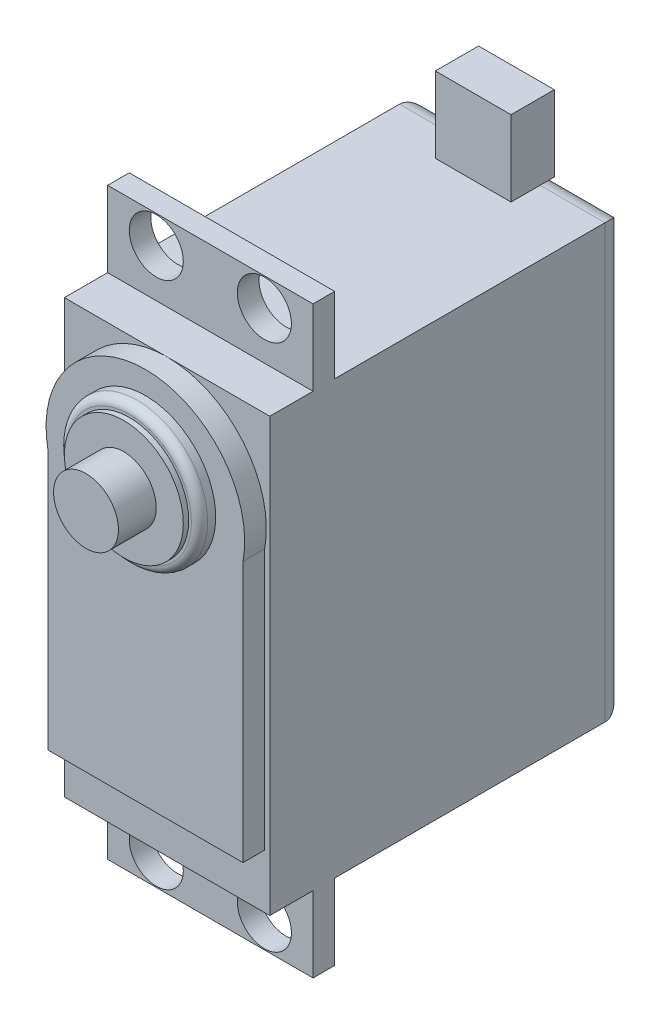
ISO-10303-21;
HEADER;
FILE_DESCRIPTION(('STEP AP214'),'2;1');
FILE_NAME('part.step','',(''),(''),'','','');
FILE_SCHEMA(('AUTOMOTIVE_DESIGN { 1 0 10303 214 1 1 1 1 }'));
ENDSEC;
DATA;
#1=APPLICATION_CONTEXT('core data for automotive mechanical design processes');
#2=APPLICATION_PROTOCOL_DEFINITION('international standard','automotive_design',2000,#1);
#3=PRODUCT_CONTEXT('',#1,'mechanical');
#4=PRODUCT('Part','Part','',(#3));
#5=PRODUCT_RELATED_PRODUCT_CATEGORY('part','',(#4));
#6=PRODUCT_DEFINITION_FORMATION('','',#4);
#7=PRODUCT_DEFINITION_CONTEXT('part definition',#1,'design');
#8=PRODUCT_DEFINITION('design','',#6,#7);
#9=PRODUCT_DEFINITION_SHAPE('','',#8);
#10=(LENGTH_UNIT() NAMED_UNIT(*) SI_UNIT(.MILLI.,.METRE.));
#11=(NAMED_UNIT(*) PLANE_ANGLE_UNIT() SI_UNIT($,.RADIAN.));
#12=(NAMED_UNIT(*) SI_UNIT($,.STERADIAN.) SOLID_ANGLE_UNIT());
#13=UNCERTAINTY_MEASURE_WITH_UNIT(LENGTH_MEASURE(1.E-05),#10,'distance_accuracy_value','');
#14=(GEOMETRIC_REPRESENTATION_CONTEXT(3) GLOBAL_UNCERTAINTY_ASSIGNED_CONTEXT((#13)) GLOBAL_UNIT_ASSIGNED_CONTEXT((#10,
#11,#12)) REPRESENTATION_CONTEXT('',''));
#15=CARTESIAN_POINT('',(0.,0.,0.));
#16=DIRECTION('',(0.,0.,1.));
#17=DIRECTION('',(1.,0.,0.));
#18=AXIS2_PLACEMENT_3D('',#15,#16,#17);
#19=CARTESIAN_POINT('',(9.5,40.,-6.));
#20=DIRECTION('',(0.,-1.,0.));
#21=DIRECTION('',(0.,0.,-1.));
#22=AXIS2_PLACEMENT_3D('',#19,#20,#21);
#23=PLANE('',#22);
#24=DIRECTION('',(0.,0.,1.));
#25=VECTOR('',#24,1.);
#26=CARTESIAN_POINT('',(-3.5,40.,-32.3142135623731));
#27=LINE('',#26,#25);
#28=CARTESIAN_POINT('',(-3.5,40.,-31.));
#29=VERTEX_POINT('',#28);
#30=CARTESIAN_POINT('',(-3.5,40.,-28.3142135623731));
#31=VERTEX_POINT('',#30);
#32=EDGE_CURVE('E517',#29,#31,#27,.T.);
#33=ORIENTED_EDGE('',*,*,#32,.F.);
#34=DIRECTION('',(-1.,0.,0.));
#35=VECTOR('',#34,1.);
#36=CARTESIAN_POINT('',(9.5,40.,-31.));
#37=LINE('',#36,#35);
#38=CARTESIAN_POINT('',(-9.5,40.,-31.));
#39=VERTEX_POINT('',#38);
#40=EDGE_CURVE('E391',#29,#39,#37,.T.);
#41=ORIENTED_EDGE('',*,*,#40,.T.);
#42=DIRECTION('',(0.,0.,1.));
#43=VECTOR('',#42,1.);
#44=CARTESIAN_POINT('',(-9.5,40.,-6.));
#45=LINE('',#44,#43);
#46=CARTESIAN_POINT('',(-9.5,40.,-6.));
#47=VERTEX_POINT('',#46);
#48=EDGE_CURVE('E333',#39,#47,#45,.T.);
#49=ORIENTED_EDGE('',*,*,#48,.T.);
#50=DIRECTION('',(-1.,0.,0.));
#51=VECTOR('',#50,1.);
#52=CARTESIAN_POINT('',(9.5,40.,-6.));
#53=LINE('',#52,#51);
#54=CARTESIAN_POINT('',(9.5,40.,-6.));
#55=VERTEX_POINT('',#54);
#56=EDGE_CURVE('E355',#55,#47,#53,.T.);
#57=ORIENTED_EDGE('',*,*,#56,.F.);
#58=DIRECTION('',(0.,0.,1.));
#59=VECTOR('',#58,1.);
#60=CARTESIAN_POINT('',(9.5,40.,-6.));
#61=LINE('',#60,#59);
#62=CARTESIAN_POINT('',(9.5,40.,-31.));
#63=VERTEX_POINT('',#62);
#64=EDGE_CURVE('E309',#63,#55,#61,.T.);
#65=ORIENTED_EDGE('',*,*,#64,.F.);
#66=CARTESIAN_POINT('',(3.5,40.,-31.));
#67=VERTEX_POINT('',#66);
#68=EDGE_CURVE('E392',#63,#67,#37,.T.);
#69=ORIENTED_EDGE('',*,*,#68,.T.);
#70=DIRECTION('',(0.,0.,-1.));
#71=VECTOR('',#70,1.);
#72=CARTESIAN_POINT('',(3.5,40.,-28.3142135623731));
#73=LINE('',#72,#71);
#74=CARTESIAN_POINT('',(3.5,40.,-28.3142135623731));
#75=VERTEX_POINT('',#74);
#76=EDGE_CURVE('E57',#75,#67,#73,.T.);
#77=ORIENTED_EDGE('',*,*,#76,.F.);
#78=DIRECTION('',(1.,0.,0.));
#79=VECTOR('',#78,1.);
#80=CARTESIAN_POINT('',(-3.5,40.,-28.3142135623731));
#81=LINE('',#80,#79);
#82=EDGE_CURVE('E52',#31,#75,#81,.T.);
#83=ORIENTED_EDGE('',*,*,#82,.F.);
#84=EDGE_LOOP('',(#33,#41,#49,#57,#65,#69,#77,#83));
#85=FACE_BOUND('',#84,.T.);
#86=ADVANCED_FACE('F37',(#85),#23,.F.);
#87=CARTESIAN_POINT('',(0.,31.409074500075,4.));
#88=DIRECTION('',(0.,0.,1.));
#89=DIRECTION('',(1.,0.,0.));
#90=AXIS2_PLACEMENT_3D('',#87,#88,#89);
#91=PLANE('',#90);
#92=CARTESIAN_POINT('',(0.,31.409074500075,4.));
#93=DIRECTION('',(0.,0.,1.));
#94=DIRECTION('',(1.,0.,0.));
#95=AXIS2_PLACEMENT_3D('',#92,#93,#94);
#96=CIRCLE('',#95,5.5);
#97=CARTESIAN_POINT('',(5.5,31.409074500075,4.));
#98=VERTEX_POINT('',#97);
#99=EDGE_CURVE('E232',#98,#98,#96,.T.);
#100=ORIENTED_EDGE('',*,*,#99,.T.);
#101=EDGE_LOOP('',(#100));
#102=FACE_BOUND('',#101,.T.);
#103=CARTESIAN_POINT('',(0.,31.409074500075,4.));
#104=DIRECTION('',(0.,0.,1.));
#105=DIRECTION('',(1.,0.,0.));
#106=AXIS2_PLACEMENT_3D('',#103,#104,#105);
#107=CIRCLE('',#106,3.);
#108=CARTESIAN_POINT('',(3.,31.409074500075,4.));
#109=VERTEX_POINT('',#108);
#110=EDGE_CURVE('E220',#109,#109,#107,.T.);
#111=ORIENTED_EDGE('',*,*,#110,.F.);
#112=EDGE_LOOP('',(#111));
#113=FACE_BOUND('',#112,.T.);
#114=ADVANCED_FACE('F429',(#102,#113),#91,.T.);
#115=CARTESIAN_POINT('',(0.,31.409074500075,3.5));
#116=DIRECTION('',(0.,0.,1.));
#117=DIRECTION('',(1.,0.,0.));
#118=AXIS2_PLACEMENT_3D('',#115,#116,#117);
#119=PLANE('',#118);
#120=CARTESIAN_POINT('',(0.,31.409074500075,3.5));
#121=DIRECTION('',(0.,0.,1.));
#122=DIRECTION('',(1.,0.,0.));
#123=AXIS2_PLACEMENT_3D('',#120,#121,#122);
#124=CIRCLE('',#123,5.75);
#125=CARTESIAN_POINT('',(5.75,31.409074500075,3.5));
#126=VERTEX_POINT('',#125);
#127=EDGE_CURVE('E45',#126,#126,#124,.T.);
#128=ORIENTED_EDGE('',*,*,#127,.T.);
#129=EDGE_LOOP('',(#128));
#130=FACE_BOUND('',#129,.T.);
#131=CARTESIAN_POINT('',(0.,31.409074500075,3.5));
#132=DIRECTION('',(0.,0.,1.));
#133=DIRECTION('',(1.,0.,0.));
#134=AXIS2_PLACEMENT_3D('',#131,#132,#133);
#135=CIRCLE('',#134,5.5);
#136=CARTESIAN_POINT('',(5.5,31.409074500075,3.5));
#137=VERTEX_POINT('',#136);
#138=EDGE_CURVE('E230',#137,#137,#135,.T.);
#139=ORIENTED_EDGE('',*,*,#138,.F.);
#140=EDGE_LOOP('',(#139));
#141=FACE_BOUND('',#140,.T.);
#142=ADVANCED_FACE('F410',(#130,#141),#119,.T.);
#143=CARTESIAN_POINT('',(-0.00799327561285847,30.8138414603454,2.));
#144=DIRECTION('',(0.,0.,-1.));
#145=DIRECTION('',(-1.,0.,0.));
#146=AXIS2_PLACEMENT_3D('',#143,#144,#145);
#147=PLANE('',#146);
#148=DIRECTION('',(0.,-1.,0.));
#149=VECTOR('',#148,1.);
#150=CARTESIAN_POINT('',(-9.03493235362916,5.,2.));
#151=LINE('',#150,#149);
#152=CARTESIAN_POINT('',(-9.03493235362916,29.1109381755252,2.));
#153=VERTEX_POINT('',#152);
#154=CARTESIAN_POINT('',(-9.03493235362916,5.,2.));
#155=VERTEX_POINT('',#154);
#156=EDGE_CURVE('E238',#153,#155,#151,.T.);
#157=ORIENTED_EDGE('',*,*,#156,.T.);
#158=DIRECTION('',(1.,0.,0.));
#159=VECTOR('',#158,1.);
#160=CARTESIAN_POINT('',(-9.03493235362916,5.,2.));
#161=LINE('',#160,#159);
#162=CARTESIAN_POINT('',(9.01894580240345,5.,2.));
#163=VERTEX_POINT('',#162);
#164=EDGE_CURVE('E241',#155,#163,#161,.T.);
#165=ORIENTED_EDGE('',*,*,#164,.T.);
#166=DIRECTION('',(0.,1.,0.));
#167=VECTOR('',#166,1.);
#168=CARTESIAN_POINT('',(9.01894580240345,5.,2.));
#169=LINE('',#168,#167);
#170=CARTESIAN_POINT('',(9.01894580240345,29.1109381755252,2.));
#171=VERTEX_POINT('',#170);
#172=EDGE_CURVE('E244',#163,#171,#169,.T.);
#173=ORIENTED_EDGE('',*,*,#172,.T.);
#174=CARTESIAN_POINT('',(-0.00799327561285847,30.8138414603454,2.));
#175=DIRECTION('',(0.,0.,1.));
#176=DIRECTION('',(-1.,0.,0.));
#177=AXIS2_PLACEMENT_3D('',#174,#175,#176);
#178=CIRCLE('',#177,9.18615853965461);
#179=EDGE_CURVE('E246',#171,#153,#178,.T.);
#180=ORIENTED_EDGE('',*,*,#179,.T.);
#181=EDGE_LOOP('',(#157,#165,#173,#180));
#182=FACE_BOUND('',#181,.T.);
#183=CARTESIAN_POINT('',(0.,31.409074500075,2.));
#184=DIRECTION('',(0.,0.,-1.));
#185=DIRECTION('',(-1.,0.,0.));
#186=AXIS2_PLACEMENT_3D('',#183,#184,#185);
#187=CIRCLE('',#186,6.5);
#188=CARTESIAN_POINT('',(-6.5,31.409074500075,2.));
#189=VERTEX_POINT('',#188);
#190=EDGE_CURVE('E397',#189,#189,#187,.F.);
#191=ORIENTED_EDGE('',*,*,#190,.F.);
#192=EDGE_LOOP('',(#191));
#193=FACE_BOUND('',#192,.T.);
#194=ADVANCED_FACE('F467',(#182,#193),#147,.F.);
#195=CARTESIAN_POINT('',(9.5,0.,0.));
#196=DIRECTION('',(0.,0.,-1.));
#197=DIRECTION('',(-1.,0.,0.));
#198=AXIS2_PLACEMENT_3D('',#195,#196,#197);
#199=PLANE('',#198);
#200=CARTESIAN_POINT('',(-0.00799327561285847,30.8138414603454,0.));
#201=DIRECTION('',(0.,0.,1.));
#202=DIRECTION('',(-1.,0.,0.));
#203=AXIS2_PLACEMENT_3D('',#200,#201,#202);
#204=CIRCLE('',#203,9.18615853965461);
#205=CARTESIAN_POINT('',(-0.00799327561285847,40.,0.));
#206=VERTEX_POINT('',#205);
#207=CARTESIAN_POINT('',(-9.03493235362916,29.1109381755252,0.));
#208=VERTEX_POINT('',#207);
#209=EDGE_CURVE('E261',#206,#208,#204,.T.);
#210=ORIENTED_EDGE('',*,*,#209,.F.);
#211=DIRECTION('',(-1.,0.,0.));
#212=VECTOR('',#211,1.);
#213=CARTESIAN_POINT('',(9.5,40.,0.));
#214=LINE('',#213,#212);
#215=CARTESIAN_POINT('',(-9.5,40.,0.));
#216=VERTEX_POINT('',#215);
#217=EDGE_CURVE('E319',#206,#216,#214,.T.);
#218=ORIENTED_EDGE('',*,*,#217,.T.);
#219=DIRECTION('',(0.,-1.,0.));
#220=VECTOR('',#219,1.);
#221=CARTESIAN_POINT('',(-9.5,0.,0.));
#222=LINE('',#221,#220);
#223=CARTESIAN_POINT('',(-9.5,0.,0.));
#224=VERTEX_POINT('',#223);
#225=EDGE_CURVE('E293',#216,#224,#222,.T.);
#226=ORIENTED_EDGE('',*,*,#225,.T.);
#227=DIRECTION('',(-1.,0.,0.));
#228=VECTOR('',#227,1.);
#229=CARTESIAN_POINT('',(9.5,0.,0.));
#230=LINE('',#229,#228);
#231=CARTESIAN_POINT('',(9.5,0.,0.));
#232=VERTEX_POINT('',#231);
#233=EDGE_CURVE('E370',#232,#224,#230,.T.);
#234=ORIENTED_EDGE('',*,*,#233,.F.);
#235=DIRECTION('',(0.,-1.,0.));
#236=VECTOR('',#235,1.);
#237=CARTESIAN_POINT('',(9.5,0.,0.));
#238=LINE('',#237,#236);
#239=CARTESIAN_POINT('',(9.5,40.,0.));
#240=VERTEX_POINT('',#239);
#241=EDGE_CURVE('E294',#240,#232,#238,.T.);
#242=ORIENTED_EDGE('',*,*,#241,.F.);
#243=EDGE_CURVE('E343',#240,#206,#214,.T.);
#244=ORIENTED_EDGE('',*,*,#243,.T.);
#245=CARTESIAN_POINT('',(9.01894580240345,29.1109381755252,0.));
#246=VERTEX_POINT('',#245);
#247=EDGE_CURVE('E242',#246,#206,#204,.T.);
#248=ORIENTED_EDGE('',*,*,#247,.F.);
#249=DIRECTION('',(0.,1.,0.));
#250=VECTOR('',#249,1.);
#251=CARTESIAN_POINT('',(9.01894580240345,5.,0.));
#252=LINE('',#251,#250);
#253=CARTESIAN_POINT('',(9.01894580240345,5.,0.));
#254=VERTEX_POINT('',#253);
#255=EDGE_CURVE('E256',#254,#246,#252,.T.);
#256=ORIENTED_EDGE('',*,*,#255,.F.);
#257=DIRECTION('',(1.,0.,0.));
#258=VECTOR('',#257,1.);
#259=CARTESIAN_POINT('',(-9.03493235362916,5.,0.));
#260=LINE('',#259,#258);
#261=CARTESIAN_POINT('',(-9.03493235362916,5.,0.));
#262=VERTEX_POINT('',#261);
#263=EDGE_CURVE('E252',#262,#254,#260,.T.);
#264=ORIENTED_EDGE('',*,*,#263,.F.);
#265=DIRECTION('',(0.,-1.,0.));
#266=VECTOR('',#265,1.);
#267=CARTESIAN_POINT('',(-9.03493235362916,5.,0.));
#268=LINE('',#267,#266);
#269=EDGE_CURVE('E249',#208,#262,#268,.T.);
#270=ORIENTED_EDGE('',*,*,#269,.F.);
#271=EDGE_LOOP('',(#210,#218,#226,#234,#242,#244,#248,#256,#264,#270));
#272=FACE_BOUND('',#271,.T.);
#273=ADVANCED_FACE('F463',(#272),#199,.F.);
#274=CARTESIAN_POINT('',(9.5,0.,0.));
#275=DIRECTION('',(0.,1.,0.));
#276=DIRECTION('',(0.,0.,1.));
#277=AXIS2_PLACEMENT_3D('',#274,#275,#276);
#278=PLANE('',#277);
#279=DIRECTION('',(0.,0.,-1.));
#280=VECTOR('',#279,1.);
#281=CARTESIAN_POINT('',(-9.5,0.,0.));
#282=LINE('',#281,#280);
#283=CARTESIAN_POINT('',(-9.5,0.,-4.));
#284=VERTEX_POINT('',#283);
#285=EDGE_CURVE('E322',#224,#284,#282,.T.);
#286=ORIENTED_EDGE('',*,*,#285,.T.);
#287=DIRECTION('',(-1.,0.,0.));
#288=VECTOR('',#287,1.);
#289=CARTESIAN_POINT('',(9.5,0.,-4.));
#290=LINE('',#289,#288);
#291=CARTESIAN_POINT('',(9.5,0.,-4.));
#292=VERTEX_POINT('',#291);
#293=EDGE_CURVE('E367',#292,#284,#290,.T.);
#294=ORIENTED_EDGE('',*,*,#293,.F.);
#295=DIRECTION('',(0.,0.,-1.));
#296=VECTOR('',#295,1.);
#297=CARTESIAN_POINT('',(9.5,0.,0.));
#298=LINE('',#297,#296);
#299=EDGE_CURVE('E297',#232,#292,#298,.T.);
#300=ORIENTED_EDGE('',*,*,#299,.F.);
#301=ORIENTED_EDGE('',*,*,#233,.T.);
#302=EDGE_LOOP('',(#286,#294,#300,#301));
#303=FACE_BOUND('',#302,.T.);
#304=ADVANCED_FACE('F459',(#303),#278,.F.);
#305=CARTESIAN_POINT('',(9.5,0.,-4.));
#306=DIRECTION('',(0.,0.,-1.));
#307=DIRECTION('',(0.,1.,0.));
#308=AXIS2_PLACEMENT_3D('',#305,#306,#307);
#309=PLANE('',#308);
#310=CARTESIAN_POINT('',(-5.,-4.4,-4.));
#311=DIRECTION('',(0.,0.,1.));
#312=DIRECTION('',(1.,0.,0.));
#313=AXIS2_PLACEMENT_3D('',#310,#311,#312);
#314=CIRCLE('',#313,2.5);
#315=CARTESIAN_POINT('',(-2.5,-4.4,-4.));
#316=VERTEX_POINT('',#315);
#317=EDGE_CURVE('E273',#316,#316,#314,.T.);
#318=ORIENTED_EDGE('',*,*,#317,.F.);
#319=EDGE_LOOP('',(#318));
#320=FACE_BOUND('',#319,.T.);
#321=CARTESIAN_POINT('',(5.,-4.4,-4.));
#322=DIRECTION('',(0.,0.,1.));
#323=DIRECTION('',(-1.,0.,0.));
#324=AXIS2_PLACEMENT_3D('',#321,#322,#323);
#325=CIRCLE('',#324,2.5);
#326=CARTESIAN_POINT('',(2.5,-4.4,-4.));
#327=VERTEX_POINT('',#326);
#328=EDGE_CURVE('E277',#327,#327,#325,.T.);
#329=ORIENTED_EDGE('',*,*,#328,.F.);
#330=EDGE_LOOP('',(#329));
#331=FACE_BOUND('',#330,.T.);
#332=DIRECTION('',(0.,-1.,0.));
#333=VECTOR('',#332,1.);
#334=CARTESIAN_POINT('',(-9.5,0.,-4.));
#335=LINE('',#334,#333);
#336=CARTESIAN_POINT('',(-9.5,-7.,-4.));
#337=VERTEX_POINT('',#336);
#338=EDGE_CURVE('E324',#284,#337,#335,.T.);
#339=ORIENTED_EDGE('',*,*,#338,.T.);
#340=DIRECTION('',(-1.,0.,0.));
#341=VECTOR('',#340,1.);
#342=CARTESIAN_POINT('',(9.5,-7.,-4.));
#343=LINE('',#342,#341);
#344=CARTESIAN_POINT('',(9.5,-7.,-4.));
#345=VERTEX_POINT('',#344);
#346=EDGE_CURVE('E364',#345,#337,#343,.T.);
#347=ORIENTED_EDGE('',*,*,#346,.F.);
#348=DIRECTION('',(0.,-1.,0.));
#349=VECTOR('',#348,1.);
#350=CARTESIAN_POINT('',(9.5,0.,-4.));
#351=LINE('',#350,#349);
#352=EDGE_CURVE('E300',#292,#345,#351,.T.);
#353=ORIENTED_EDGE('',*,*,#352,.F.);
#354=ORIENTED_EDGE('',*,*,#293,.T.);
#355=EDGE_LOOP('',(#339,#347,#353,#354));
#356=FACE_BOUND('',#355,.T.);
#357=ADVANCED_FACE('F455',(#320,#331,#356),#309,.F.);
#358=CARTESIAN_POINT('',(9.5,-7.,-4.));
#359=DIRECTION('',(0.,1.,0.));
#360=DIRECTION('',(0.,0.,1.));
#361=AXIS2_PLACEMENT_3D('',#358,#359,#360);
#362=PLANE('',#361);
#363=DIRECTION('',(0.,0.,-1.));
#364=VECTOR('',#363,1.);
#365=CARTESIAN_POINT('',(-9.5,-7.,-4.));
#366=LINE('',#365,#364);
#367=CARTESIAN_POINT('',(-9.5,-7.,-6.));
#368=VERTEX_POINT('',#367);
#369=EDGE_CURVE('E326',#337,#368,#366,.T.);
#370=ORIENTED_EDGE('',*,*,#369,.T.);
#371=DIRECTION('',(-1.,0.,0.));
#372=VECTOR('',#371,1.);
#373=CARTESIAN_POINT('',(9.5,-7.,-6.));
#374=LINE('',#373,#372);
#375=CARTESIAN_POINT('',(9.5,-7.,-6.));
#376=VERTEX_POINT('',#375);
#377=EDGE_CURVE('E361',#376,#368,#374,.T.);
#378=ORIENTED_EDGE('',*,*,#377,.F.);
#379=DIRECTION('',(0.,0.,-1.));
#380=VECTOR('',#379,1.);
#381=CARTESIAN_POINT('',(9.5,-7.,-4.));
#382=LINE('',#381,#380);
#383=EDGE_CURVE('E302',#345,#376,#382,.T.);
#384=ORIENTED_EDGE('',*,*,#383,.F.);
#385=ORIENTED_EDGE('',*,*,#346,.T.);
#386=EDGE_LOOP('',(#370,#378,#384,#385));
#387=FACE_BOUND('',#386,.T.);
#388=ADVANCED_FACE('F451',(#387),#362,.F.);
#389=CARTESIAN_POINT('',(9.5,-7.,-6.));
#390=DIRECTION('',(0.,0.,1.));
#391=DIRECTION('',(1.,0.,0.));
#392=AXIS2_PLACEMENT_3D('',#389,#390,#391);
#393=PLANE('',#392);
#394=CARTESIAN_POINT('',(-5.,-4.4,-6.));
#395=DIRECTION('',(0.,0.,1.));
#396=DIRECTION('',(1.,0.,0.));
#397=AXIS2_PLACEMENT_3D('',#394,#395,#396);
#398=CIRCLE('',#397,2.5);
#399=CARTESIAN_POINT('',(-2.5,-4.4,-6.));
#400=VERTEX_POINT('',#399);
#401=EDGE_CURVE('E276',#400,#400,#398,.T.);
#402=ORIENTED_EDGE('',*,*,#401,.T.);
#403=EDGE_LOOP('',(#402));
#404=FACE_BOUND('',#403,.T.);
#405=CARTESIAN_POINT('',(5.,-4.4,-6.));
#406=DIRECTION('',(0.,0.,1.));
#407=DIRECTION('',(1.,0.,0.));
#408=AXIS2_PLACEMENT_3D('',#405,#406,#407);
#409=CIRCLE('',#408,2.5);
#410=CARTESIAN_POINT('',(7.5,-4.4,-6.));
#411=VERTEX_POINT('',#410);
#412=EDGE_CURVE('E280',#411,#411,#409,.T.);
#413=ORIENTED_EDGE('',*,*,#412,.T.);
#414=EDGE_LOOP('',(#413));
#415=FACE_BOUND('',#414,.T.);
#416=DIRECTION('',(0.,1.,0.));
#417=VECTOR('',#416,1.);
#418=CARTESIAN_POINT('',(-9.5,-7.,-6.));
#419=LINE('',#418,#417);
#420=CARTESIAN_POINT('',(-9.5,0.,-6.));
#421=VERTEX_POINT('',#420);
#422=EDGE_CURVE('E328',#368,#421,#419,.T.);
#423=ORIENTED_EDGE('',*,*,#422,.T.);
#424=DIRECTION('',(-1.,0.,0.));
#425=VECTOR('',#424,1.);
#426=CARTESIAN_POINT('',(9.5,0.,-6.));
#427=LINE('',#426,#425);
#428=CARTESIAN_POINT('',(9.5,0.,-6.));
#429=VERTEX_POINT('',#428);
#430=EDGE_CURVE('E358',#429,#421,#427,.T.);
#431=ORIENTED_EDGE('',*,*,#430,.F.);
#432=DIRECTION('',(0.,1.,0.));
#433=VECTOR('',#432,1.);
#434=CARTESIAN_POINT('',(9.5,-7.,-6.));
#435=LINE('',#434,#433);
#436=EDGE_CURVE('E304',#376,#429,#435,.T.);
#437=ORIENTED_EDGE('',*,*,#436,.F.);
#438=ORIENTED_EDGE('',*,*,#377,.T.);
#439=EDGE_LOOP('',(#423,#431,#437,#438));
#440=FACE_BOUND('',#439,.T.);
#441=ADVANCED_FACE('F447',(#404,#415,#440),#393,.F.);
#442=CARTESIAN_POINT('',(9.5,0.,-6.));
#443=DIRECTION('',(0.,1.,0.));
#444=DIRECTION('',(0.,0.,1.));
#445=AXIS2_PLACEMENT_3D('',#442,#443,#444);
#446=PLANE('',#445);
#447=DIRECTION('',(0.,0.,-1.));
#448=VECTOR('',#447,1.);
#449=CARTESIAN_POINT('',(-9.5,0.,-6.));
#450=LINE('',#449,#448);
#451=CARTESIAN_POINT('',(-9.5,0.,-31.));
#452=VERTEX_POINT('',#451);
#453=EDGE_CURVE('E330',#421,#452,#450,.T.);
#454=ORIENTED_EDGE('',*,*,#453,.T.);
#455=DIRECTION('',(-1.,0.,0.));
#456=VECTOR('',#455,1.);
#457=CARTESIAN_POINT('',(9.5,0.,-31.));
#458=LINE('',#457,#456);
#459=CARTESIAN_POINT('',(9.5,0.,-31.));
#460=VERTEX_POINT('',#459);
#461=EDGE_CURVE('E386',#452,#460,#458,.F.);
#462=ORIENTED_EDGE('',*,*,#461,.T.);
#463=DIRECTION('',(0.,0.,-1.));
#464=VECTOR('',#463,1.);
#465=CARTESIAN_POINT('',(9.5,0.,-6.));
#466=LINE('',#465,#464);
#467=EDGE_CURVE('E306',#429,#460,#466,.T.);
#468=ORIENTED_EDGE('',*,*,#467,.F.);
#469=ORIENTED_EDGE('',*,*,#430,.T.);
#470=EDGE_LOOP('',(#454,#462,#468,#469));
#471=FACE_BOUND('',#470,.T.);
#472=ADVANCED_FACE('F443',(#471),#446,.F.);
#473=CARTESIAN_POINT('',(9.5,0.,-33.));
#474=DIRECTION('',(0.,0.,1.));
#475=DIRECTION('',(1.,0.,0.));
#476=AXIS2_PLACEMENT_3D('',#473,#474,#475);
#477=PLANE('',#476);
#478=DIRECTION('',(0.,1.,0.));
#479=VECTOR('',#478,1.);
#480=CARTESIAN_POINT('',(7.5,0.,-33.));
#481=LINE('',#480,#479);
#482=CARTESIAN_POINT('',(7.5,38.,-33.));
#483=VERTEX_POINT('',#482);
#484=CARTESIAN_POINT('',(7.5,2.,-33.));
#485=VERTEX_POINT('',#484);
#486=EDGE_CURVE('E381',#483,#485,#481,.F.);
#487=ORIENTED_EDGE('',*,*,#486,.T.);
#488=DIRECTION('',(-1.,0.,0.));
#489=VECTOR('',#488,1.);
#490=CARTESIAN_POINT('',(9.5,2.,-33.));
#491=LINE('',#490,#489);
#492=CARTESIAN_POINT('',(-7.5,2.,-33.));
#493=VERTEX_POINT('',#492);
#494=EDGE_CURVE('E383',#485,#493,#491,.T.);
#495=ORIENTED_EDGE('',*,*,#494,.T.);
#496=DIRECTION('',(0.,1.,0.));
#497=VECTOR('',#496,1.);
#498=CARTESIAN_POINT('',(-7.5,40.,-33.));
#499=LINE('',#498,#497);
#500=CARTESIAN_POINT('',(-7.5,38.,-33.));
#501=VERTEX_POINT('',#500);
#502=EDGE_CURVE('E377',#493,#501,#499,.T.);
#503=ORIENTED_EDGE('',*,*,#502,.T.);
#504=DIRECTION('',(-1.,0.,0.));
#505=VECTOR('',#504,1.);
#506=CARTESIAN_POINT('',(9.5,38.,-33.));
#507=LINE('',#506,#505);
#508=EDGE_CURVE('E379',#501,#483,#507,.F.);
#509=ORIENTED_EDGE('',*,*,#508,.T.);
#510=EDGE_LOOP('',(#487,#495,#503,#509));
#511=FACE_BOUND('',#510,.T.);
#512=ADVANCED_FACE('F440',(#511),#477,.F.);
#513=CARTESIAN_POINT('',(9.5,47.,-6.));
#514=DIRECTION('',(0.,0.,1.));
#515=DIRECTION('',(1.,0.,0.));
#516=AXIS2_PLACEMENT_3D('',#513,#514,#515);
#517=PLANE('',#516);
#518=CARTESIAN_POINT('',(-5.,44.4,-6.));
#519=DIRECTION('',(0.,0.,1.));
#520=DIRECTION('',(1.,0.,0.));
#521=AXIS2_PLACEMENT_3D('',#518,#519,#520);
#522=CIRCLE('',#521,2.5);
#523=CARTESIAN_POINT('',(-2.5,44.4,-6.));
#524=VERTEX_POINT('',#523);
#525=EDGE_CURVE('E284',#524,#524,#522,.T.);
#526=ORIENTED_EDGE('',*,*,#525,.T.);
#527=EDGE_LOOP('',(#526));
#528=FACE_BOUND('',#527,.T.);
#529=CARTESIAN_POINT('',(5.,44.4,-6.));
#530=DIRECTION('',(0.,0.,1.));
#531=DIRECTION('',(1.,0.,0.));
#532=AXIS2_PLACEMENT_3D('',#529,#530,#531);
#533=CIRCLE('',#532,2.5);
#534=CARTESIAN_POINT('',(7.5,44.4,-6.));
#535=VERTEX_POINT('',#534);
#536=EDGE_CURVE('E290',#535,#535,#533,.T.);
#537=ORIENTED_EDGE('',*,*,#536,.T.);
#538=EDGE_LOOP('',(#537));
#539=FACE_BOUND('',#538,.T.);
#540=DIRECTION('',(0.,1.,0.));
#541=VECTOR('',#540,1.);
#542=CARTESIAN_POINT('',(-9.5,47.,-6.));
#543=LINE('',#542,#541);
#544=CARTESIAN_POINT('',(-9.5,47.,-6.));
#545=VERTEX_POINT('',#544);
#546=EDGE_CURVE('E335',#47,#545,#543,.T.);
#547=ORIENTED_EDGE('',*,*,#546,.T.);
#548=DIRECTION('',(-1.,0.,0.));
#549=VECTOR('',#548,1.);
#550=CARTESIAN_POINT('',(9.5,47.,-6.));
#551=LINE('',#550,#549);
#552=CARTESIAN_POINT('',(9.5,47.,-6.));
#553=VERTEX_POINT('',#552);
#554=EDGE_CURVE('E352',#553,#545,#551,.T.);
#555=ORIENTED_EDGE('',*,*,#554,.F.);
#556=DIRECTION('',(0.,1.,0.));
#557=VECTOR('',#556,1.);
#558=CARTESIAN_POINT('',(9.5,47.,-6.));
#559=LINE('',#558,#557);
#560=EDGE_CURVE('E311',#55,#553,#559,.T.);
#561=ORIENTED_EDGE('',*,*,#560,.F.);
#562=ORIENTED_EDGE('',*,*,#56,.T.);
#563=EDGE_LOOP('',(#547,#555,#561,#562));
#564=FACE_BOUND('',#563,.T.);
#565=ADVANCED_FACE('F438',(#528,#539,#564),#517,.F.);
#566=CARTESIAN_POINT('',(9.5,47.,-4.));
#567=DIRECTION('',(0.,-1.,0.));
#568=DIRECTION('',(0.,0.,-1.));
#569=AXIS2_PLACEMENT_3D('',#566,#567,#568);
#570=PLANE('',#569);
#571=DIRECTION('',(0.,0.,1.));
#572=VECTOR('',#571,1.);
#573=CARTESIAN_POINT('',(-9.5,47.,-4.));
#574=LINE('',#573,#572);
#575=CARTESIAN_POINT('',(-9.5,47.,-4.));
#576=VERTEX_POINT('',#575);
#577=EDGE_CURVE('E337',#545,#576,#574,.T.);
#578=ORIENTED_EDGE('',*,*,#577,.T.);
#579=DIRECTION('',(-1.,0.,0.));
#580=VECTOR('',#579,1.);
#581=CARTESIAN_POINT('',(9.5,47.,-4.));
#582=LINE('',#581,#580);
#583=CARTESIAN_POINT('',(9.5,47.,-4.));
#584=VERTEX_POINT('',#583);
#585=EDGE_CURVE('E349',#584,#576,#582,.T.);
#586=ORIENTED_EDGE('',*,*,#585,.F.);
#587=DIRECTION('',(0.,0.,1.));
#588=VECTOR('',#587,1.);
#589=CARTESIAN_POINT('',(9.5,47.,-4.));
#590=LINE('',#589,#588);
#591=EDGE_CURVE('E313',#553,#584,#590,.T.);
#592=ORIENTED_EDGE('',*,*,#591,.F.);
#593=ORIENTED_EDGE('',*,*,#554,.T.);
#594=EDGE_LOOP('',(#578,#586,#592,#593));
#595=FACE_BOUND('',#594,.T.);
#596=ADVANCED_FACE('F595',(#595),#570,.F.);
#597=CARTESIAN_POINT('',(9.5,40.,-4.));
#598=DIRECTION('',(0.,0.,-1.));
#599=DIRECTION('',(0.,1.,0.));
#600=AXIS2_PLACEMENT_3D('',#597,#598,#599);
#601=PLANE('',#600);
#602=CARTESIAN_POINT('',(-5.,44.4,-4.));
#603=DIRECTION('',(0.,0.,1.));
#604=DIRECTION('',(-1.,0.,0.));
#605=AXIS2_PLACEMENT_3D('',#602,#603,#604);
#606=CIRCLE('',#605,2.5);
#607=CARTESIAN_POINT('',(-7.5,44.4,-4.));
#608=VERTEX_POINT('',#607);
#609=EDGE_CURVE('E281',#608,#608,#606,.T.);
#610=ORIENTED_EDGE('',*,*,#609,.F.);
#611=EDGE_LOOP('',(#610));
#612=FACE_BOUND('',#611,.T.);
#613=CARTESIAN_POINT('',(5.,44.4,-4.));
#614=DIRECTION('',(0.,0.,1.));
#615=DIRECTION('',(1.,0.,0.));
#616=AXIS2_PLACEMENT_3D('',#613,#614,#615);
#617=CIRCLE('',#616,2.5);
#618=CARTESIAN_POINT('',(7.5,44.4,-4.));
#619=VERTEX_POINT('',#618);
#620=EDGE_CURVE('E287',#619,#619,#617,.T.);
#621=ORIENTED_EDGE('',*,*,#620,.F.);
#622=EDGE_LOOP('',(#621));
#623=FACE_BOUND('',#622,.T.);
#624=DIRECTION('',(0.,-1.,0.));
#625=VECTOR('',#624,1.);
#626=CARTESIAN_POINT('',(-9.5,40.,-4.));
#627=LINE('',#626,#625);
#628=CARTESIAN_POINT('',(-9.5,40.,-4.));
#629=VERTEX_POINT('',#628);
#630=EDGE_CURVE('E339',#576,#629,#627,.T.);
#631=ORIENTED_EDGE('',*,*,#630,.T.);
#632=DIRECTION('',(-1.,0.,0.));
#633=VECTOR('',#632,1.);
#634=CARTESIAN_POINT('',(9.5,40.,-4.));
#635=LINE('',#634,#633);
#636=CARTESIAN_POINT('',(9.5,40.,-4.));
#637=VERTEX_POINT('',#636);
#638=EDGE_CURVE('E346',#637,#629,#635,.T.);
#639=ORIENTED_EDGE('',*,*,#638,.F.);
#640=DIRECTION('',(0.,-1.,0.));
#641=VECTOR('',#640,1.);
#642=CARTESIAN_POINT('',(9.5,40.,-4.));
#643=LINE('',#642,#641);
#644=EDGE_CURVE('E315',#584,#637,#643,.T.);
#645=ORIENTED_EDGE('',*,*,#644,.F.);
#646=ORIENTED_EDGE('',*,*,#585,.T.);
#647=EDGE_LOOP('',(#631,#639,#645,#646));
#648=FACE_BOUND('',#647,.T.);
#649=ADVANCED_FACE('F592',(#612,#623,#648),#601,.F.);
#650=CARTESIAN_POINT('',(9.5,40.,0.));
#651=DIRECTION('',(0.,-1.,0.));
#652=DIRECTION('',(0.,0.,-1.));
#653=AXIS2_PLACEMENT_3D('',#650,#651,#652);
#654=PLANE('',#653);
#655=DIRECTION('',(0.,0.,1.));
#656=VECTOR('',#655,1.);
#657=CARTESIAN_POINT('',(-9.5,40.,0.));
#658=LINE('',#657,#656);
#659=EDGE_CURVE('E298',#629,#216,#658,.T.);
#660=ORIENTED_EDGE('',*,*,#659,.T.);
#661=ORIENTED_EDGE('',*,*,#217,.F.);
#662=ORIENTED_EDGE('',*,*,#243,.F.);
#663=DIRECTION('',(0.,0.,1.));
#664=VECTOR('',#663,1.);
#665=CARTESIAN_POINT('',(9.5,40.,0.));
#666=LINE('',#665,#664);
#667=EDGE_CURVE('E317',#637,#240,#666,.T.);
#668=ORIENTED_EDGE('',*,*,#667,.F.);
#669=ORIENTED_EDGE('',*,*,#638,.T.);
#670=EDGE_LOOP('',(#660,#661,#662,#668,#669));
#671=FACE_BOUND('',#670,.T.);
#672=ADVANCED_FACE('F587',(#671),#654,.F.);
#673=CARTESIAN_POINT('',(9.5,0.,0.));
#674=DIRECTION('',(-1.,0.,0.));
#675=DIRECTION('',(0.,0.,1.));
#676=AXIS2_PLACEMENT_3D('',#673,#674,#675);
#677=PLANE('',#676);
#678=ORIENTED_EDGE('',*,*,#467,.T.);
#679=DIRECTION('',(0.,1.,0.));
#680=VECTOR('',#679,1.);
#681=CARTESIAN_POINT('',(9.5,0.,-31.));
#682=LINE('',#681,#680);
#683=EDGE_CURVE('E389',#460,#63,#682,.T.);
#684=ORIENTED_EDGE('',*,*,#683,.T.);
#685=ORIENTED_EDGE('',*,*,#64,.T.);
#686=ORIENTED_EDGE('',*,*,#560,.T.);
#687=ORIENTED_EDGE('',*,*,#591,.T.);
#688=ORIENTED_EDGE('',*,*,#644,.T.);
#689=ORIENTED_EDGE('',*,*,#667,.T.);
#690=ORIENTED_EDGE('',*,*,#241,.T.);
#691=ORIENTED_EDGE('',*,*,#299,.T.);
#692=ORIENTED_EDGE('',*,*,#352,.T.);
#693=ORIENTED_EDGE('',*,*,#383,.T.);
#694=ORIENTED_EDGE('',*,*,#436,.T.);
#695=EDGE_LOOP('',(#678,#684,#685,#686,#687,#688,#689,#690,#691,#692,#693,#694));
#696=FACE_BOUND('',#695,.T.);
#697=ADVANCED_FACE('F510',(#696),#677,.F.);
#698=CARTESIAN_POINT('',(-9.5,0.,0.));
#699=DIRECTION('',(-1.,0.,0.));
#700=DIRECTION('',(0.,0.,1.));
#701=AXIS2_PLACEMENT_3D('',#698,#699,#700);
#702=PLANE('',#701);
#703=ORIENTED_EDGE('',*,*,#48,.F.);
#704=DIRECTION('',(0.,1.,0.));
#705=VECTOR('',#704,1.);
#706=CARTESIAN_POINT('',(-9.5,0.,-31.));
#707=LINE('',#706,#705);
#708=EDGE_CURVE('E394',#39,#452,#707,.F.);
#709=ORIENTED_EDGE('',*,*,#708,.T.);
#710=ORIENTED_EDGE('',*,*,#453,.F.);
#711=ORIENTED_EDGE('',*,*,#422,.F.);
#712=ORIENTED_EDGE('',*,*,#369,.F.);
#713=ORIENTED_EDGE('',*,*,#338,.F.);
#714=ORIENTED_EDGE('',*,*,#285,.F.);
#715=ORIENTED_EDGE('',*,*,#225,.F.);
#716=ORIENTED_EDGE('',*,*,#659,.F.);
#717=ORIENTED_EDGE('',*,*,#630,.F.);
#718=ORIENTED_EDGE('',*,*,#577,.F.);
#719=ORIENTED_EDGE('',*,*,#546,.F.);
#720=EDGE_LOOP('',(#703,#709,#710,#711,#712,#713,#714,#715,#716,#717,#718,#719));
#721=FACE_BOUND('',#720,.T.);
#722=ADVANCED_FACE('F498',(#721),#702,.T.);
#723=CARTESIAN_POINT('',(5.,44.4,-14.));
#724=DIRECTION('',(0.,0.,1.));
#725=DIRECTION('',(1.,0.,0.));
#726=AXIS2_PLACEMENT_3D('',#723,#724,#725);
#727=CYLINDRICAL_SURFACE('',#726,2.5);
#728=ORIENTED_EDGE('',*,*,#620,.T.);
#729=EDGE_LOOP('',(#728));
#730=FACE_BOUND('',#729,.T.);
#731=ORIENTED_EDGE('',*,*,#536,.F.);
#732=EDGE_LOOP('',(#731));
#733=FACE_BOUND('',#732,.T.);
#734=ADVANCED_FACE('F580',(#730,#733),#727,.F.);
#735=CARTESIAN_POINT('',(-5.,44.4,-14.));
#736=DIRECTION('',(0.,0.,1.));
#737=DIRECTION('',(1.,0.,0.));
#738=AXIS2_PLACEMENT_3D('',#735,#736,#737);
#739=CYLINDRICAL_SURFACE('',#738,2.5);
#740=ORIENTED_EDGE('',*,*,#609,.T.);
#741=EDGE_LOOP('',(#740));
#742=FACE_BOUND('',#741,.T.);
#743=ORIENTED_EDGE('',*,*,#525,.F.);
#744=EDGE_LOOP('',(#743));
#745=FACE_BOUND('',#744,.T.);
#746=ADVANCED_FACE('F576',(#742,#745),#739,.F.);
#747=CARTESIAN_POINT('',(5.,-4.4,-14.));
#748=DIRECTION('',(0.,0.,1.));
#749=DIRECTION('',(1.,0.,0.));
#750=AXIS2_PLACEMENT_3D('',#747,#748,#749);
#751=CYLINDRICAL_SURFACE('',#750,2.5);
#752=ORIENTED_EDGE('',*,*,#328,.T.);
#753=EDGE_LOOP('',(#752));
#754=FACE_BOUND('',#753,.T.);
#755=ORIENTED_EDGE('',*,*,#412,.F.);
#756=EDGE_LOOP('',(#755));
#757=FACE_BOUND('',#756,.T.);
#758=ADVANCED_FACE('F572',(#754,#757),#751,.F.);
#759=CARTESIAN_POINT('',(-5.,-4.4,-14.));
#760=DIRECTION('',(0.,0.,1.));
#761=DIRECTION('',(1.,0.,0.));
#762=AXIS2_PLACEMENT_3D('',#759,#760,#761);
#763=CYLINDRICAL_SURFACE('',#762,2.5);
#764=ORIENTED_EDGE('',*,*,#317,.T.);
#765=EDGE_LOOP('',(#764));
#766=FACE_BOUND('',#765,.T.);
#767=ORIENTED_EDGE('',*,*,#401,.F.);
#768=EDGE_LOOP('',(#767));
#769=FACE_BOUND('',#768,.T.);
#770=ADVANCED_FACE('F568',(#766,#769),#763,.F.);
#771=CARTESIAN_POINT('',(-9.03493235362916,5.,2.));
#772=DIRECTION('',(1.,0.,0.));
#773=DIRECTION('',(0.,0.,-1.));
#774=AXIS2_PLACEMENT_3D('',#771,#772,#773);
#775=PLANE('',#774);
#776=ORIENTED_EDGE('',*,*,#269,.T.);
#777=DIRECTION('',(0.,0.,-1.));
#778=VECTOR('',#777,1.);
#779=CARTESIAN_POINT('',(-9.03493235362916,5.,2.));
#780=LINE('',#779,#778);
#781=EDGE_CURVE('E270',#155,#262,#780,.T.);
#782=ORIENTED_EDGE('',*,*,#781,.F.);
#783=ORIENTED_EDGE('',*,*,#156,.F.);
#784=DIRECTION('',(0.,0.,-1.));
#785=VECTOR('',#784,1.);
#786=CARTESIAN_POINT('',(-9.03493235362916,29.1109381755252,2.));
#787=LINE('',#786,#785);
#788=EDGE_CURVE('E248',#153,#208,#787,.T.);
#789=ORIENTED_EDGE('',*,*,#788,.T.);
#790=EDGE_LOOP('',(#776,#782,#783,#789));
#791=FACE_BOUND('',#790,.T.);
#792=ADVANCED_FACE('F564',(#791),#775,.F.);
#793=CARTESIAN_POINT('',(-9.03493235362916,5.,2.));
#794=DIRECTION('',(0.,1.,0.));
#795=DIRECTION('',(0.,0.,1.));
#796=AXIS2_PLACEMENT_3D('',#793,#794,#795);
#797=PLANE('',#796);
#798=ORIENTED_EDGE('',*,*,#263,.T.);
#799=DIRECTION('',(0.,0.,-1.));
#800=VECTOR('',#799,1.);
#801=CARTESIAN_POINT('',(9.01894580240345,5.,2.));
#802=LINE('',#801,#800);
#803=EDGE_CURVE('E267',#163,#254,#802,.T.);
#804=ORIENTED_EDGE('',*,*,#803,.F.);
#805=ORIENTED_EDGE('',*,*,#164,.F.);
#806=ORIENTED_EDGE('',*,*,#781,.T.);
#807=EDGE_LOOP('',(#798,#804,#805,#806));
#808=FACE_BOUND('',#807,.T.);
#809=ADVANCED_FACE('F560',(#808),#797,.F.);
#810=CARTESIAN_POINT('',(9.01894580240345,5.,2.));
#811=DIRECTION('',(-1.,0.,0.));
#812=DIRECTION('',(0.,0.,1.));
#813=AXIS2_PLACEMENT_3D('',#810,#811,#812);
#814=PLANE('',#813);
#815=ORIENTED_EDGE('',*,*,#255,.T.);
#816=DIRECTION('',(0.,0.,-1.));
#817=VECTOR('',#816,1.);
#818=CARTESIAN_POINT('',(9.01894580240345,29.1109381755252,2.));
#819=LINE('',#818,#817);
#820=EDGE_CURVE('E264',#171,#246,#819,.T.);
#821=ORIENTED_EDGE('',*,*,#820,.F.);
#822=ORIENTED_EDGE('',*,*,#172,.F.);
#823=ORIENTED_EDGE('',*,*,#803,.T.);
#824=EDGE_LOOP('',(#815,#821,#822,#823));
#825=FACE_BOUND('',#824,.T.);
#826=ADVANCED_FACE('F486',(#825),#814,.F.);
#827=CARTESIAN_POINT('',(-0.00799327561285847,30.8138414603454,2.));
#828=DIRECTION('',(0.,0.,-1.));
#829=DIRECTION('',(-1.,0.,0.));
#830=AXIS2_PLACEMENT_3D('',#827,#828,#829);
#831=CYLINDRICAL_SURFACE('',#830,9.18615853965461);
#832=ORIENTED_EDGE('',*,*,#247,.T.);
#833=ORIENTED_EDGE('',*,*,#209,.T.);
#834=ORIENTED_EDGE('',*,*,#788,.F.);
#835=ORIENTED_EDGE('',*,*,#179,.F.);
#836=ORIENTED_EDGE('',*,*,#820,.T.);
#837=EDGE_LOOP('',(#832,#833,#834,#835,#836));
#838=FACE_BOUND('',#837,.T.);
#839=ADVANCED_FACE('F481',(#838),#831,.T.);
#840=CARTESIAN_POINT('',(9.5,38.,-31.));
#841=DIRECTION('',(-1.,0.,0.));
#842=DIRECTION('',(0.,0.,1.));
#843=AXIS2_PLACEMENT_3D('',#840,#841,#842);
#844=CYLINDRICAL_SURFACE('',#843,2.);
#845=CARTESIAN_POINT('',(-7.5,38.,-31.));
#846=DIRECTION('',(-0.707106781186547,-0.707106781186547,0.));
#847=DIRECTION('',(0.707106781186547,-0.707106781186547,0.));
#848=AXIS2_PLACEMENT_3D('',#845,#846,#847);
#849=ELLIPSE('',#848,2.82842712474619,2.);
#850=EDGE_CURVE('E401',#39,#501,#849,.T.);
#851=ORIENTED_EDGE('',*,*,#850,.F.);
#852=ORIENTED_EDGE('',*,*,#40,.F.);
#853=EDGE_CURVE('E395',#67,#29,#37,.T.);
#854=ORIENTED_EDGE('',*,*,#853,.F.);
#855=ORIENTED_EDGE('',*,*,#68,.F.);
#856=CARTESIAN_POINT('',(7.5,38.,-31.));
#857=DIRECTION('',(-0.707106781186547,0.707106781186547,0.));
#858=DIRECTION('',(-0.707106781186547,-0.707106781186547,0.));
#859=AXIS2_PLACEMENT_3D('',#856,#857,#858);
#860=ELLIPSE('',#859,2.82842712474619,2.);
#861=EDGE_CURVE('E253',#483,#63,#860,.F.);
#862=ORIENTED_EDGE('',*,*,#861,.F.);
#863=ORIENTED_EDGE('',*,*,#508,.F.);
#864=EDGE_LOOP('',(#851,#852,#854,#855,#862,#863));
#865=FACE_BOUND('',#864,.T.);
#866=ADVANCED_FACE('F478',(#865),#844,.T.);
#867=CARTESIAN_POINT('',(7.5,0.,-31.));
#868=DIRECTION('',(0.,1.,0.));
#869=DIRECTION('',(0.,0.,1.));
#870=AXIS2_PLACEMENT_3D('',#867,#868,#869);
#871=CYLINDRICAL_SURFACE('',#870,2.);
#872=ORIENTED_EDGE('',*,*,#861,.T.);
#873=ORIENTED_EDGE('',*,*,#683,.F.);
#874=CARTESIAN_POINT('',(7.5,2.,-31.));
#875=DIRECTION('',(0.707106781186547,0.707106781186547,0.));
#876=DIRECTION('',(-0.707106781186547,0.707106781186547,0.));
#877=AXIS2_PLACEMENT_3D('',#874,#875,#876);
#878=ELLIPSE('',#877,2.82842712474619,2.);
#879=EDGE_CURVE('E399',#485,#460,#878,.F.);
#880=ORIENTED_EDGE('',*,*,#879,.F.);
#881=ORIENTED_EDGE('',*,*,#486,.F.);
#882=EDGE_LOOP('',(#872,#873,#880,#881));
#883=FACE_BOUND('',#882,.T.);
#884=ADVANCED_FACE('F475',(#883),#871,.T.);
#885=CARTESIAN_POINT('',(-7.5,0.,-31.));
#886=DIRECTION('',(0.,-1.,0.));
#887=DIRECTION('',(0.,0.,-1.));
#888=AXIS2_PLACEMENT_3D('',#885,#886,#887);
#889=CYLINDRICAL_SURFACE('',#888,2.);
#890=ORIENTED_EDGE('',*,*,#850,.T.);
#891=ORIENTED_EDGE('',*,*,#502,.F.);
#892=CARTESIAN_POINT('',(-7.5,2.,-31.));
#893=DIRECTION('',(0.707106781186547,-0.707106781186547,0.));
#894=DIRECTION('',(-0.707106781186547,-0.707106781186547,0.));
#895=AXIS2_PLACEMENT_3D('',#892,#893,#894);
#896=ELLIPSE('',#895,2.82842712474619,2.);
#897=EDGE_CURVE('E235',#452,#493,#896,.T.);
#898=ORIENTED_EDGE('',*,*,#897,.F.);
#899=ORIENTED_EDGE('',*,*,#708,.F.);
#900=EDGE_LOOP('',(#890,#891,#898,#899));
#901=FACE_BOUND('',#900,.T.);
#902=ADVANCED_FACE('F471',(#901),#889,.T.);
#903=CARTESIAN_POINT('',(9.5,2.,-31.));
#904=DIRECTION('',(-1.,0.,0.));
#905=DIRECTION('',(0.,0.,1.));
#906=AXIS2_PLACEMENT_3D('',#903,#904,#905);
#907=CYLINDRICAL_SURFACE('',#906,2.);
#908=ORIENTED_EDGE('',*,*,#879,.T.);
#909=ORIENTED_EDGE('',*,*,#461,.F.);
#910=ORIENTED_EDGE('',*,*,#897,.T.);
#911=ORIENTED_EDGE('',*,*,#494,.F.);
#912=EDGE_LOOP('',(#908,#909,#910,#911));
#913=FACE_BOUND('',#912,.T.);
#914=ADVANCED_FACE('F424',(#913),#907,.T.);
#915=CARTESIAN_POINT('',(0.,31.409074500075,3.5));
#916=DIRECTION('',(0.,0.,-1.));
#917=DIRECTION('',(-1.,0.,0.));
#918=AXIS2_PLACEMENT_3D('',#915,#916,#917);
#919=CYLINDRICAL_SURFACE('',#918,6.5);
#920=CARTESIAN_POINT('',(0.,31.409074500075,2.75));
#921=DIRECTION('',(0.,0.,1.));
#922=DIRECTION('',(1.,0.,0.));
#923=AXIS2_PLACEMENT_3D('',#920,#921,#922);
#924=CIRCLE('',#923,6.5);
#925=CARTESIAN_POINT('',(6.5,31.409074500075,2.75));
#926=VERTEX_POINT('',#925);
#927=EDGE_CURVE('E11',#926,#926,#924,.F.);
#928=ORIENTED_EDGE('',*,*,#927,.T.);
#929=EDGE_LOOP('',(#928));
#930=FACE_BOUND('',#929,.T.);
#931=ORIENTED_EDGE('',*,*,#190,.T.);
#932=EDGE_LOOP('',(#931));
#933=FACE_BOUND('',#932,.T.);
#934=ADVANCED_FACE('F415',(#930,#933),#919,.T.);
#935=CARTESIAN_POINT('',(0.,31.409074500075,2.75));
#936=DIRECTION('',(0.,0.,1.));
#937=DIRECTION('',(1.,0.,0.));
#938=AXIS2_PLACEMENT_3D('',#935,#936,#937);
#939=TOROIDAL_SURFACE('',#938,5.75,0.75);
#940=ORIENTED_EDGE('',*,*,#927,.F.);
#941=EDGE_LOOP('',(#940));
#942=FACE_BOUND('',#941,.T.);
#943=ORIENTED_EDGE('',*,*,#127,.F.);
#944=EDGE_LOOP('',(#943));
#945=FACE_BOUND('',#944,.T.);
#946=ADVANCED_FACE('F39',(#942,#945),#939,.T.);
#947=CARTESIAN_POINT('',(0.,31.409074500075,4.));
#948=DIRECTION('',(0.,0.,-1.));
#949=DIRECTION('',(-1.,0.,0.));
#950=AXIS2_PLACEMENT_3D('',#947,#948,#949);
#951=CYLINDRICAL_SURFACE('',#950,5.5);
#952=ORIENTED_EDGE('',*,*,#99,.F.);
#953=EDGE_LOOP('',(#952));
#954=FACE_BOUND('',#953,.T.);
#955=ORIENTED_EDGE('',*,*,#138,.T.);
#956=EDGE_LOOP('',(#955));
#957=FACE_BOUND('',#956,.T.);
#958=ADVANCED_FACE('F414',(#954,#957),#951,.T.);
#959=CARTESIAN_POINT('',(0.,31.409074500075,7.5));
#960=DIRECTION('',(0.,0.,-1.));
#961=DIRECTION('',(-1.,0.,0.));
#962=AXIS2_PLACEMENT_3D('',#959,#960,#961);
#963=CYLINDRICAL_SURFACE('',#962,3.);
#964=CARTESIAN_POINT('',(0.,31.409074500075,7.5));
#965=DIRECTION('',(0.,0.,1.));
#966=DIRECTION('',(1.,0.,0.));
#967=AXIS2_PLACEMENT_3D('',#964,#965,#966);
#968=CIRCLE('',#967,3.);
#969=CARTESIAN_POINT('',(3.,31.409074500075,7.5));
#970=VERTEX_POINT('',#969);
#971=EDGE_CURVE('E223',#970,#970,#968,.T.);
#972=ORIENTED_EDGE('',*,*,#971,.F.);
#973=EDGE_LOOP('',(#972));
#974=FACE_BOUND('',#973,.T.);
#975=ORIENTED_EDGE('',*,*,#110,.T.);
#976=EDGE_LOOP('',(#975));
#977=FACE_BOUND('',#976,.T.);
#978=ADVANCED_FACE('F421',(#974,#977),#963,.T.);
#979=CARTESIAN_POINT('',(0.,31.409074500075,7.5));
#980=DIRECTION('',(0.,0.,1.));
#981=DIRECTION('',(1.,0.,0.));
#982=AXIS2_PLACEMENT_3D('',#979,#980,#981);
#983=PLANE('',#982);
#984=ORIENTED_EDGE('',*,*,#971,.T.);
#985=EDGE_LOOP('',(#984));
#986=FACE_BOUND('',#985,.T.);
#987=ADVANCED_FACE('F546',(#986),#983,.T.);
#988=CARTESIAN_POINT('',(3.5,47.,-32.3142135623731));
#989=DIRECTION('',(0.,0.,1.));
#990=DIRECTION('',(1.,0.,0.));
#991=AXIS2_PLACEMENT_3D('',#988,#989,#990);
#992=PLANE('',#991);
#993=DIRECTION('',(-1.,0.,0.));
#994=VECTOR('',#993,1.);
#995=CARTESIAN_POINT('',(3.5,40.,-32.3142135623731));
#996=LINE('',#995,#994);
#997=CARTESIAN_POINT('',(3.5,40.,-32.3142135623731));
#998=VERTEX_POINT('',#997);
#999=CARTESIAN_POINT('',(-3.5,40.,-32.3142135623731));
#1000=VERTEX_POINT('',#999);
#1001=EDGE_CURVE('E219',#998,#1000,#996,.T.);
#1002=ORIENTED_EDGE('',*,*,#1001,.T.);
#1003=DIRECTION('',(0.,-1.,0.));
#1004=VECTOR('',#1003,1.);
#1005=CARTESIAN_POINT('',(-3.5,47.,-32.3142135623731));
#1006=LINE('',#1005,#1004);
#1007=CARTESIAN_POINT('',(-3.5,47.,-32.3142135623731));
#1008=VERTEX_POINT('',#1007);
#1009=EDGE_CURVE('E200',#1008,#1000,#1006,.T.);
#1010=ORIENTED_EDGE('',*,*,#1009,.F.);
#1011=DIRECTION('',(-1.,0.,0.));
#1012=VECTOR('',#1011,1.);
#1013=CARTESIAN_POINT('',(3.5,47.,-32.3142135623731));
#1014=LINE('',#1013,#1012);
#1015=CARTESIAN_POINT('',(3.5,47.,-32.3142135623731));
#1016=VERTEX_POINT('',#1015);
#1017=EDGE_CURVE('E207',#1016,#1008,#1014,.T.);
#1018=ORIENTED_EDGE('',*,*,#1017,.F.);
#1019=DIRECTION('',(0.,-1.,0.));
#1020=VECTOR('',#1019,1.);
#1021=CARTESIAN_POINT('',(3.5,47.,-32.3142135623731));
#1022=LINE('',#1021,#1020);
#1023=EDGE_CURVE('E526',#1016,#998,#1022,.T.);
#1024=ORIENTED_EDGE('',*,*,#1023,.T.);
#1025=EDGE_LOOP('',(#1002,#1010,#1018,#1024));
#1026=FACE_BOUND('',#1025,.T.);
#1027=ADVANCED_FACE('F217',(#1026),#992,.F.);
#1028=CARTESIAN_POINT('',(-3.5,47.,-32.3142135623731));
#1029=DIRECTION('',(1.,0.,0.));
#1030=DIRECTION('',(0.,0.,-1.));
#1031=AXIS2_PLACEMENT_3D('',#1028,#1029,#1030);
#1032=PLANE('',#1031);
#1033=EDGE_CURVE('E518',#1000,#29,#27,.T.);
#1034=ORIENTED_EDGE('',*,*,#1033,.T.);
#1035=ORIENTED_EDGE('',*,*,#32,.T.);
#1036=DIRECTION('',(0.,-1.,0.));
#1037=VECTOR('',#1036,1.);
#1038=CARTESIAN_POINT('',(-3.5,47.,-28.3142135623731));
#1039=LINE('',#1038,#1037);
#1040=CARTESIAN_POINT('',(-3.5,47.,-28.3142135623731));
#1041=VERTEX_POINT('',#1040);
#1042=EDGE_CURVE('E203',#1041,#31,#1039,.T.);
#1043=ORIENTED_EDGE('',*,*,#1042,.F.);
#1044=DIRECTION('',(0.,0.,1.));
#1045=VECTOR('',#1044,1.);
#1046=CARTESIAN_POINT('',(-3.5,47.,-32.3142135623731));
#1047=LINE('',#1046,#1045);
#1048=EDGE_CURVE('E195',#1008,#1041,#1047,.T.);
#1049=ORIENTED_EDGE('',*,*,#1048,.F.);
#1050=ORIENTED_EDGE('',*,*,#1009,.T.);
#1051=EDGE_LOOP('',(#1034,#1035,#1043,#1049,#1050));
#1052=FACE_BOUND('',#1051,.T.);
#1053=ADVANCED_FACE('F198',(#1052),#1032,.F.);
#1054=CARTESIAN_POINT('',(-3.5,47.,-28.3142135623731));
#1055=DIRECTION('',(0.,0.,-1.));
#1056=DIRECTION('',(-1.,0.,0.));
#1057=AXIS2_PLACEMENT_3D('',#1054,#1055,#1056);
#1058=PLANE('',#1057);
#1059=ORIENTED_EDGE('',*,*,#82,.T.);
#1060=DIRECTION('',(0.,-1.,0.));
#1061=VECTOR('',#1060,1.);
#1062=CARTESIAN_POINT('',(3.5,47.,-28.3142135623731));
#1063=LINE('',#1062,#1061);
#1064=CARTESIAN_POINT('',(3.5,47.,-28.3142135623731));
#1065=VERTEX_POINT('',#1064);
#1066=EDGE_CURVE('E225',#1065,#75,#1063,.T.);
#1067=ORIENTED_EDGE('',*,*,#1066,.F.);
#1068=DIRECTION('',(1.,0.,0.));
#1069=VECTOR('',#1068,1.);
#1070=CARTESIAN_POINT('',(-3.5,47.,-28.3142135623731));
#1071=LINE('',#1070,#1069);
#1072=EDGE_CURVE('E206',#1041,#1065,#1071,.T.);
#1073=ORIENTED_EDGE('',*,*,#1072,.F.);
#1074=ORIENTED_EDGE('',*,*,#1042,.T.);
#1075=EDGE_LOOP('',(#1059,#1067,#1073,#1074));
#1076=FACE_BOUND('',#1075,.T.);
#1077=ADVANCED_FACE('F532',(#1076),#1058,.F.);
#1078=CARTESIAN_POINT('',(3.5,47.,-28.3142135623731));
#1079=DIRECTION('',(-1.,0.,0.));
#1080=DIRECTION('',(0.,0.,1.));
#1081=AXIS2_PLACEMENT_3D('',#1078,#1079,#1080);
#1082=PLANE('',#1081);
#1083=ORIENTED_EDGE('',*,*,#76,.T.);
#1084=EDGE_CURVE('E524',#67,#998,#73,.T.);
#1085=ORIENTED_EDGE('',*,*,#1084,.T.);
#1086=ORIENTED_EDGE('',*,*,#1023,.F.);
#1087=DIRECTION('',(0.,0.,-1.));
#1088=VECTOR('',#1087,1.);
#1089=CARTESIAN_POINT('',(3.5,47.,-28.3142135623731));
#1090=LINE('',#1089,#1088);
#1091=EDGE_CURVE('E212',#1065,#1016,#1090,.T.);
#1092=ORIENTED_EDGE('',*,*,#1091,.F.);
#1093=ORIENTED_EDGE('',*,*,#1066,.T.);
#1094=EDGE_LOOP('',(#1083,#1085,#1086,#1092,#1093));
#1095=FACE_BOUND('',#1094,.T.);
#1096=ADVANCED_FACE('F530',(#1095),#1082,.F.);
#1097=CARTESIAN_POINT('',(0.,47.,0.));
#1098=DIRECTION('',(0.,1.,0.));
#1099=DIRECTION('',(0.,0.,1.));
#1100=AXIS2_PLACEMENT_3D('',#1097,#1098,#1099);
#1101=PLANE('',#1100);
#1102=ORIENTED_EDGE('',*,*,#1017,.T.);
#1103=ORIENTED_EDGE('',*,*,#1048,.T.);
#1104=ORIENTED_EDGE('',*,*,#1072,.T.);
#1105=ORIENTED_EDGE('',*,*,#1091,.T.);
#1106=EDGE_LOOP('',(#1102,#1103,#1104,#1105));
#1107=FACE_BOUND('',#1106,.T.);
#1108=ADVANCED_FACE('F210',(#1107),#1101,.T.);
#1109=CARTESIAN_POINT('',(0.,40.,0.));
#1110=DIRECTION('',(0.,1.,0.));
#1111=DIRECTION('',(0.,0.,1.));
#1112=AXIS2_PLACEMENT_3D('',#1109,#1110,#1111);
#1113=PLANE('',#1112);
#1114=ORIENTED_EDGE('',*,*,#853,.T.);
#1115=ORIENTED_EDGE('',*,*,#1033,.F.);
#1116=ORIENTED_EDGE('',*,*,#1001,.F.);
#1117=ORIENTED_EDGE('',*,*,#1084,.F.);
#1118=EDGE_LOOP('',(#1114,#1115,#1116,#1117));
#1119=FACE_BOUND('',#1118,.T.);
#1120=ADVANCED_FACE('F752',(#1119),#1113,.F.);
#1121=CLOSED_SHELL('',(#86,#114,#142,#194,#273,#304,#357,#388,#441,#472,#512,#565,#596,#649,
#672,#697,#722,#734,#746,#758,#770,#792,#809,#826,#839,#866,#884,#902,#914,#934,#946,#958,#978,
#987,#1027,#1053,#1077,#1096,#1108,#1120));
#1122=MANIFOLD_SOLID_BREP('B2',#1121);
#1123=ADVANCED_BREP_SHAPE_REPRESENTATION('',(#18,#1122),#14);
#1124=SHAPE_DEFINITION_REPRESENTATION(#9,#1123);
ENDSEC;
END-ISO-10303-21;
